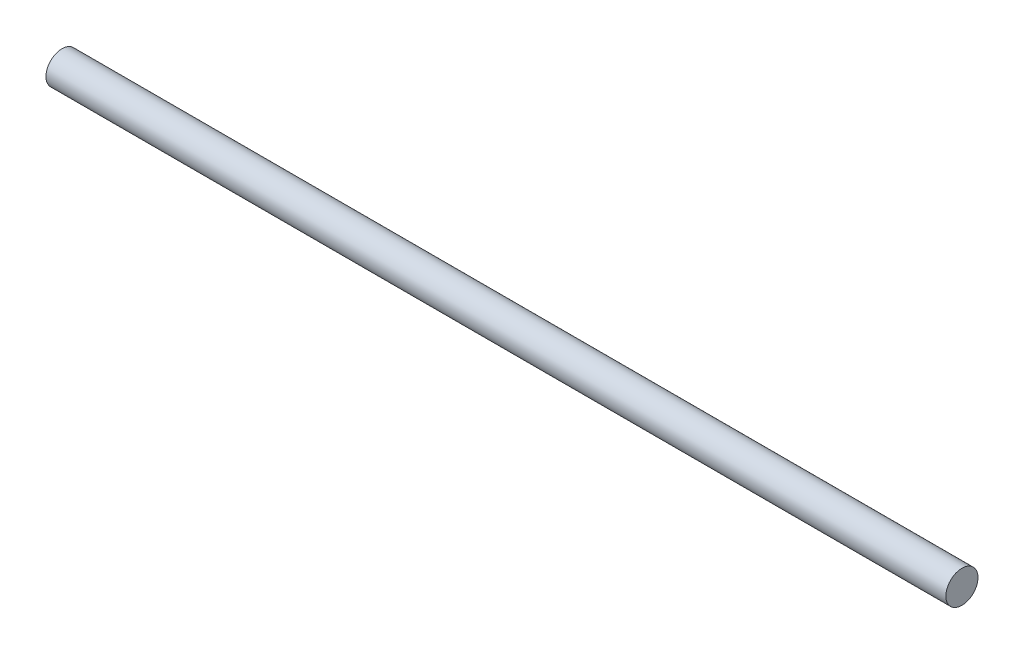
ISO-10303-21;
HEADER;
FILE_DESCRIPTION(('STEP AP214'),'2;1');
FILE_NAME('part.step','',(''),(''),'','','');
FILE_SCHEMA(('AUTOMOTIVE_DESIGN { 1 0 10303 214 1 1 1 1 }'));
ENDSEC;
DATA;
#1=APPLICATION_CONTEXT('core data for automotive mechanical design processes');
#2=APPLICATION_PROTOCOL_DEFINITION('international standard','automotive_design',2000,#1);
#3=PRODUCT_CONTEXT('',#1,'mechanical');
#4=PRODUCT('Part','Part','',(#3));
#5=PRODUCT_RELATED_PRODUCT_CATEGORY('part','',(#4));
#6=PRODUCT_DEFINITION_FORMATION('','',#4);
#7=PRODUCT_DEFINITION_CONTEXT('part definition',#1,'design');
#8=PRODUCT_DEFINITION('design','',#6,#7);
#9=PRODUCT_DEFINITION_SHAPE('','',#8);
#10=(LENGTH_UNIT() NAMED_UNIT(*) SI_UNIT(.MILLI.,.METRE.));
#11=(NAMED_UNIT(*) PLANE_ANGLE_UNIT() SI_UNIT($,.RADIAN.));
#12=(NAMED_UNIT(*) SI_UNIT($,.STERADIAN.) SOLID_ANGLE_UNIT());
#13=UNCERTAINTY_MEASURE_WITH_UNIT(LENGTH_MEASURE(1.E-05),#10,'distance_accuracy_value','');
#14=(GEOMETRIC_REPRESENTATION_CONTEXT(3) GLOBAL_UNCERTAINTY_ASSIGNED_CONTEXT((#13)) GLOBAL_UNIT_ASSIGNED_CONTEXT((#10,
#11,#12)) REPRESENTATION_CONTEXT('',''));
#15=CARTESIAN_POINT('',(0.,0.,0.));
#16=DIRECTION('',(0.,0.,1.));
#17=DIRECTION('',(1.,0.,0.));
#18=AXIS2_PLACEMENT_3D('',#15,#16,#17);
#19=CARTESIAN_POINT('',(140.,0.,0.));
#20=DIRECTION('',(-1.,0.,0.));
#21=DIRECTION('',(0.,0.,1.));
#22=AXIS2_PLACEMENT_3D('',#19,#20,#21);
#23=CYLINDRICAL_SURFACE('',#22,2.5);
#24=CARTESIAN_POINT('',(140.,0.,0.));
#25=DIRECTION('',(1.,0.,0.));
#26=DIRECTION('',(0.,0.,-1.));
#27=AXIS2_PLACEMENT_3D('',#24,#25,#26);
#28=CIRCLE('',#27,2.5);
#29=CARTESIAN_POINT('',(140.,0.,-2.5));
#30=VERTEX_POINT('',#29);
#31=EDGE_CURVE('E10',#30,#30,#28,.T.);
#32=ORIENTED_EDGE('',*,*,#31,.F.);
#33=EDGE_LOOP('',(#32));
#34=FACE_BOUND('',#33,.T.);
#35=CARTESIAN_POINT('',(0.,0.,0.));
#36=DIRECTION('',(1.,0.,0.));
#37=DIRECTION('',(0.,0.,-1.));
#38=AXIS2_PLACEMENT_3D('',#35,#36,#37);
#39=CIRCLE('',#38,2.5);
#40=CARTESIAN_POINT('',(0.,0.,-2.5));
#41=VERTEX_POINT('',#40);
#42=EDGE_CURVE('E38',#41,#41,#39,.T.);
#43=ORIENTED_EDGE('',*,*,#42,.T.);
#44=EDGE_LOOP('',(#43));
#45=FACE_BOUND('',#44,.T.);
#46=ADVANCED_FACE('F35',(#34,#45),#23,.T.);
#47=CARTESIAN_POINT('',(140.,0.,0.));
#48=DIRECTION('',(1.,0.,0.));
#49=DIRECTION('',(0.,0.,-1.));
#50=AXIS2_PLACEMENT_3D('',#47,#48,#49);
#51=PLANE('',#50);
#52=ORIENTED_EDGE('',*,*,#31,.T.);
#53=EDGE_LOOP('',(#52));
#54=FACE_BOUND('',#53,.T.);
#55=ADVANCED_FACE('F50',(#54),#51,.T.);
#56=CARTESIAN_POINT('',(0.,0.,0.));
#57=DIRECTION('',(1.,0.,0.));
#58=DIRECTION('',(0.,0.,-1.));
#59=AXIS2_PLACEMENT_3D('',#56,#57,#58);
#60=PLANE('',#59);
#61=ORIENTED_EDGE('',*,*,#42,.F.);
#62=EDGE_LOOP('',(#61));
#63=FACE_BOUND('',#62,.T.);
#64=ADVANCED_FACE('F48',(#63),#60,.F.);
#65=CLOSED_SHELL('',(#46,#55,#64));
#66=MANIFOLD_SOLID_BREP('B2',#65);
#67=ADVANCED_BREP_SHAPE_REPRESENTATION('',(#18,#66),#14);
#68=SHAPE_DEFINITION_REPRESENTATION(#9,#67);
ENDSEC;
END-ISO-10303-21;
